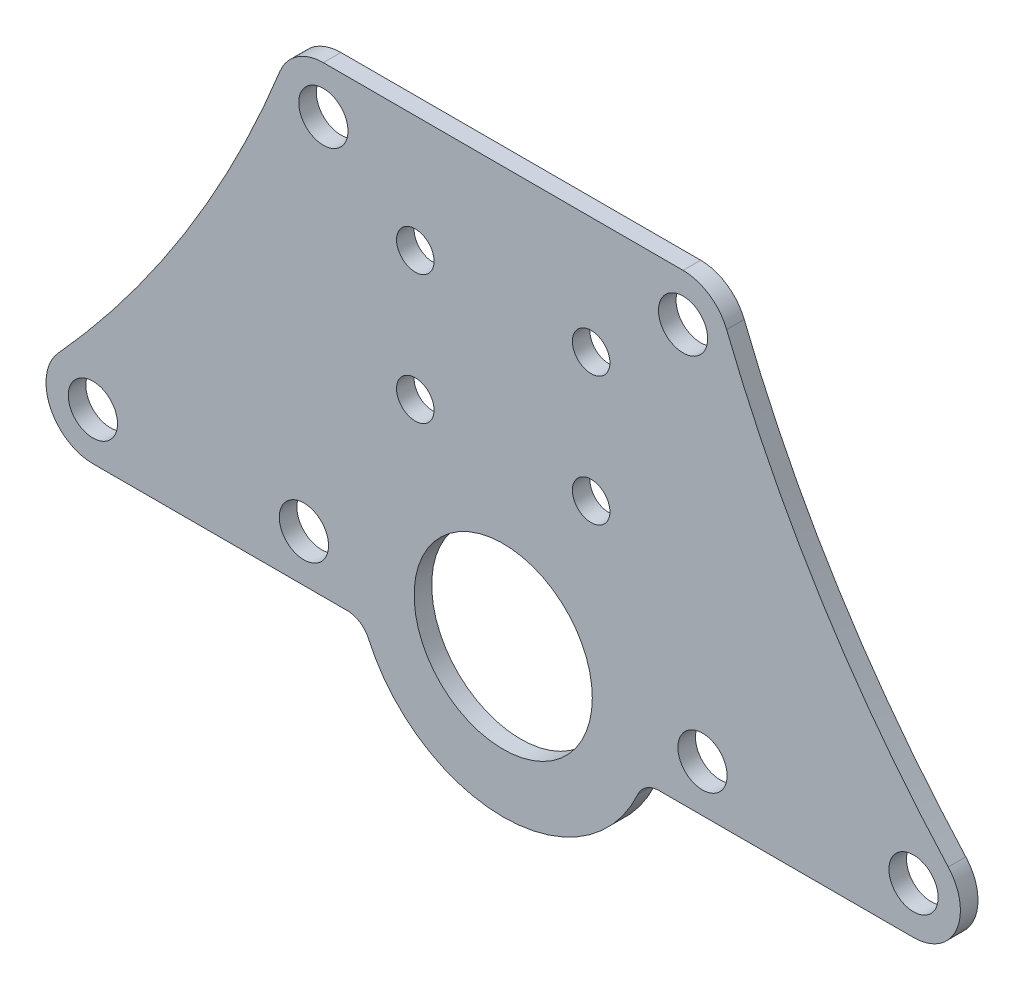
ISO-10303-21;
HEADER;
FILE_DESCRIPTION(('STEP AP214'),'2;1');
FILE_NAME('part.step','',(''),(''),'','','');
FILE_SCHEMA(('AUTOMOTIVE_DESIGN { 1 0 10303 214 1 1 1 1 }'));
ENDSEC;
DATA;
#1=APPLICATION_CONTEXT('core data for automotive mechanical design processes');
#2=APPLICATION_PROTOCOL_DEFINITION('international standard','automotive_design',2000,#1);
#3=PRODUCT_CONTEXT('',#1,'mechanical');
#4=PRODUCT('Part','Part','',(#3));
#5=PRODUCT_RELATED_PRODUCT_CATEGORY('part','',(#4));
#6=PRODUCT_DEFINITION_FORMATION('','',#4);
#7=PRODUCT_DEFINITION_CONTEXT('part definition',#1,'design');
#8=PRODUCT_DEFINITION('design','',#6,#7);
#9=PRODUCT_DEFINITION_SHAPE('','',#8);
#10=(LENGTH_UNIT() NAMED_UNIT(*) SI_UNIT(.MILLI.,.METRE.));
#11=(NAMED_UNIT(*) PLANE_ANGLE_UNIT() SI_UNIT($,.RADIAN.));
#12=(NAMED_UNIT(*) SI_UNIT($,.STERADIAN.) SOLID_ANGLE_UNIT());
#13=UNCERTAINTY_MEASURE_WITH_UNIT(LENGTH_MEASURE(1.E-05),#10,'distance_accuracy_value','');
#14=(GEOMETRIC_REPRESENTATION_CONTEXT(3) GLOBAL_UNCERTAINTY_ASSIGNED_CONTEXT((#13)) GLOBAL_UNIT_ASSIGNED_CONTEXT((#10,
#11,#12)) REPRESENTATION_CONTEXT('',''));
#15=CARTESIAN_POINT('',(0.,0.,0.));
#16=DIRECTION('',(0.,0.,1.));
#17=DIRECTION('',(1.,0.,0.));
#18=AXIS2_PLACEMENT_3D('',#15,#16,#17);
#19=CARTESIAN_POINT('',(0.,-20.,1.5));
#20=DIRECTION('',(0.,0.,-1.));
#21=DIRECTION('',(-1.,0.,0.));
#22=AXIS2_PLACEMENT_3D('',#19,#20,#21);
#23=CYLINDRICAL_SURFACE('',#22,12.6);
#24=CARTESIAN_POINT('',(0.,-20.,0.));
#25=DIRECTION('',(0.,0.,1.));
#26=DIRECTION('',(1.,0.,0.));
#27=AXIS2_PLACEMENT_3D('',#24,#25,#26);
#28=CIRCLE('',#27,12.6);
#29=CARTESIAN_POINT('',(-11.4868387650895,-25.1780821917808,0.));
#30=VERTEX_POINT('',#29);
#31=CARTESIAN_POINT('',(11.4868387650895,-25.1780821917808,0.));
#32=VERTEX_POINT('',#31);
#33=EDGE_CURVE('E230',#30,#32,#28,.T.);
#34=ORIENTED_EDGE('',*,*,#33,.T.);
#35=DIRECTION('',(0.,0.,-1.));
#36=VECTOR('',#35,1.);
#37=CARTESIAN_POINT('',(11.4868387650895,-25.1780821917808,1.5));
#38=LINE('',#37,#36);
#39=CARTESIAN_POINT('',(11.4868387650895,-25.1780821917808,1.5));
#40=VERTEX_POINT('',#39);
#41=EDGE_CURVE('E222',#32,#40,#38,.F.);
#42=ORIENTED_EDGE('',*,*,#41,.T.);
#43=CARTESIAN_POINT('',(0.,-20.,1.5));
#44=DIRECTION('',(0.,0.,1.));
#45=DIRECTION('',(1.,0.,0.));
#46=AXIS2_PLACEMENT_3D('',#43,#44,#45);
#47=CIRCLE('',#46,12.6);
#48=CARTESIAN_POINT('',(-11.4868387650895,-25.1780821917808,1.5));
#49=VERTEX_POINT('',#48);
#50=EDGE_CURVE('E139',#49,#40,#47,.T.);
#51=ORIENTED_EDGE('',*,*,#50,.F.);
#52=DIRECTION('',(0.,0.,-1.));
#53=VECTOR('',#52,1.);
#54=CARTESIAN_POINT('',(-11.4868387650895,-25.1780821917808,1.5));
#55=LINE('',#54,#53);
#56=EDGE_CURVE('E219',#49,#30,#55,.T.);
#57=ORIENTED_EDGE('',*,*,#56,.T.);
#58=EDGE_LOOP('',(#34,#42,#51,#57));
#59=FACE_BOUND('',#58,.T.);
#60=ADVANCED_FACE('F37',(#59),#23,.T.);
#61=CARTESIAN_POINT('',(0.,-24.,1.5));
#62=DIRECTION('',(0.,1.,0.));
#63=DIRECTION('',(-1.,0.,0.));
#64=AXIS2_PLACEMENT_3D('',#61,#62,#63);
#65=PLANE('',#64);
#66=DIRECTION('',(1.,0.,0.));
#67=VECTOR('',#66,1.);
#68=CARTESIAN_POINT('',(0.,-24.,1.5));
#69=LINE('',#68,#67);
#70=CARTESIAN_POINT('',(13.3101465055799,-24.,1.5));
#71=VERTEX_POINT('',#70);
#72=CARTESIAN_POINT('',(35.,-24.,1.5));
#73=VERTEX_POINT('',#72);
#74=EDGE_CURVE('E125',#71,#73,#69,.T.);
#75=ORIENTED_EDGE('',*,*,#74,.F.);
#76=DIRECTION('',(0.,0.,1.));
#77=VECTOR('',#76,1.);
#78=CARTESIAN_POINT('',(13.3101465055799,-24.,0.));
#79=LINE('',#78,#77);
#80=CARTESIAN_POINT('',(13.3101465055799,-24.,0.));
#81=VERTEX_POINT('',#80);
#82=EDGE_CURVE('E149',#71,#81,#79,.F.);
#83=ORIENTED_EDGE('',*,*,#82,.T.);
#84=DIRECTION('',(1.,0.,0.));
#85=VECTOR('',#84,1.);
#86=CARTESIAN_POINT('',(0.,-24.,0.));
#87=LINE('',#86,#85);
#88=CARTESIAN_POINT('',(35.,-24.,0.));
#89=VERTEX_POINT('',#88);
#90=EDGE_CURVE('E145',#81,#89,#87,.T.);
#91=ORIENTED_EDGE('',*,*,#90,.T.);
#92=DIRECTION('',(0.,0.,-1.));
#93=VECTOR('',#92,1.);
#94=CARTESIAN_POINT('',(35.,-24.,1.5));
#95=LINE('',#94,#93);
#96=EDGE_CURVE('E142',#73,#89,#95,.T.);
#97=ORIENTED_EDGE('',*,*,#96,.F.);
#98=EDGE_LOOP('',(#75,#83,#91,#97));
#99=FACE_BOUND('',#98,.T.);
#100=ADVANCED_FACE('F143',(#99),#65,.F.);
#101=CARTESIAN_POINT('',(35.,-20.,1.5));
#102=DIRECTION('',(0.,0.,-1.));
#103=DIRECTION('',(-1.,0.,0.));
#104=AXIS2_PLACEMENT_3D('',#101,#102,#103);
#105=CYLINDRICAL_SURFACE('',#104,4.00000000000002);
#106=CARTESIAN_POINT('',(35.,-20.,0.));
#107=DIRECTION('',(0.,0.,1.));
#108=DIRECTION('',(1.,0.,0.));
#109=AXIS2_PLACEMENT_3D('',#106,#107,#108);
#110=CIRCLE('',#109,4.00000000000002);
#111=CARTESIAN_POINT('',(37.9597935701072,-17.3093454286453,0.));
#112=VERTEX_POINT('',#111);
#113=EDGE_CURVE('E493',#89,#112,#110,.T.);
#114=ORIENTED_EDGE('',*,*,#113,.T.);
#115=DIRECTION('',(0.,0.,-1.));
#116=VECTOR('',#115,1.);
#117=CARTESIAN_POINT('',(37.9597935701072,-17.3093454286453,1.5));
#118=LINE('',#117,#116);
#119=CARTESIAN_POINT('',(37.9597935701072,-17.3093454286453,1.5));
#120=VERTEX_POINT('',#119);
#121=EDGE_CURVE('E150',#120,#112,#118,.T.);
#122=ORIENTED_EDGE('',*,*,#121,.F.);
#123=CARTESIAN_POINT('',(35.,-20.,1.5));
#124=DIRECTION('',(0.,0.,1.));
#125=DIRECTION('',(1.,0.,0.));
#126=AXIS2_PLACEMENT_3D('',#123,#124,#125);
#127=CIRCLE('',#126,4.00000000000002);
#128=EDGE_CURVE('E131',#73,#120,#127,.T.);
#129=ORIENTED_EDGE('',*,*,#128,.F.);
#130=ORIENTED_EDGE('',*,*,#96,.T.);
#131=EDGE_LOOP('',(#114,#122,#129,#130));
#132=FACE_BOUND('',#131,.T.);
#133=ADVANCED_FACE('F152',(#132),#105,.T.);
#134=CARTESIAN_POINT('',(111.954632822788,49.9570188552223,1.5));
#135=DIRECTION('',(0.,0.,-1.));
#136=DIRECTION('',(-1.,0.,0.));
#137=AXIS2_PLACEMENT_3D('',#134,#135,#136);
#138=CYLINDRICAL_SURFACE('',#137,100.);
#139=CARTESIAN_POINT('',(111.954632822788,49.9570188552223,0.));
#140=DIRECTION('',(0.,0.,1.));
#141=DIRECTION('',(1.,0.,0.));
#142=AXIS2_PLACEMENT_3D('',#139,#140,#141);
#143=CIRCLE('',#142,100.);
#144=CARTESIAN_POINT('',(19.0588225485857,12.9385311294998,0.));
#145=VERTEX_POINT('',#144);
#146=EDGE_CURVE('E495',#145,#112,#143,.T.);
#147=ORIENTED_EDGE('',*,*,#146,.F.);
#148=DIRECTION('',(0.,0.,-1.));
#149=VECTOR('',#148,1.);
#150=CARTESIAN_POINT('',(19.0588225485857,12.9385311294998,1.5));
#151=LINE('',#150,#149);
#152=CARTESIAN_POINT('',(19.0588225485857,12.9385311294998,1.5));
#153=VERTEX_POINT('',#152);
#154=EDGE_CURVE('E215',#153,#145,#151,.T.);
#155=ORIENTED_EDGE('',*,*,#154,.F.);
#156=CARTESIAN_POINT('',(111.954632822788,49.9570188552223,1.5));
#157=DIRECTION('',(0.,0.,1.));
#158=DIRECTION('',(1.,0.,0.));
#159=AXIS2_PLACEMENT_3D('',#156,#157,#158);
#160=CIRCLE('',#159,100.);
#161=EDGE_CURVE('E154',#153,#120,#160,.T.);
#162=ORIENTED_EDGE('',*,*,#161,.T.);
#163=ORIENTED_EDGE('',*,*,#121,.T.);
#164=EDGE_LOOP('',(#147,#155,#162,#163));
#165=FACE_BOUND('',#164,.T.);
#166=ADVANCED_FACE('F253',(#165),#138,.F.);
#167=CARTESIAN_POINT('',(15.3429901376176,11.4577916204709,1.5));
#168=DIRECTION('',(0.,0.,-1.));
#169=DIRECTION('',(-1.,0.,0.));
#170=AXIS2_PLACEMENT_3D('',#167,#168,#169);
#171=CYLINDRICAL_SURFACE('',#170,4.00000000000002);
#172=CARTESIAN_POINT('',(15.3429901376176,11.4577916204709,0.));
#173=DIRECTION('',(0.,0.,1.));
#174=DIRECTION('',(1.,0.,0.));
#175=AXIS2_PLACEMENT_3D('',#172,#173,#174);
#176=CIRCLE('',#175,4.00000000000002);
#177=CARTESIAN_POINT('',(15.3429901376176,15.4577916204709,0.));
#178=VERTEX_POINT('',#177);
#179=EDGE_CURVE('E498',#145,#178,#176,.T.);
#180=ORIENTED_EDGE('',*,*,#179,.T.);
#181=DIRECTION('',(0.,0.,-1.));
#182=VECTOR('',#181,1.);
#183=CARTESIAN_POINT('',(15.3429901376176,15.4577916204709,1.5));
#184=LINE('',#183,#182);
#185=CARTESIAN_POINT('',(15.3429901376176,15.4577916204709,1.5));
#186=VERTEX_POINT('',#185);
#187=EDGE_CURVE('E213',#186,#178,#184,.T.);
#188=ORIENTED_EDGE('',*,*,#187,.F.);
#189=CARTESIAN_POINT('',(15.3429901376176,11.4577916204709,1.5));
#190=DIRECTION('',(0.,0.,1.));
#191=DIRECTION('',(1.,0.,0.));
#192=AXIS2_PLACEMENT_3D('',#189,#190,#191);
#193=CIRCLE('',#192,4.00000000000002);
#194=EDGE_CURVE('E156',#153,#186,#193,.T.);
#195=ORIENTED_EDGE('',*,*,#194,.F.);
#196=ORIENTED_EDGE('',*,*,#154,.T.);
#197=EDGE_LOOP('',(#180,#188,#195,#196));
#198=FACE_BOUND('',#197,.T.);
#199=ADVANCED_FACE('F256',(#198),#171,.T.);
#200=CARTESIAN_POINT('',(0.,15.4577916204709,1.5));
#201=DIRECTION('',(0.,1.,0.));
#202=DIRECTION('',(0.,0.,1.));
#203=AXIS2_PLACEMENT_3D('',#200,#201,#202);
#204=PLANE('',#203);
#205=DIRECTION('',(1.,0.,0.));
#206=VECTOR('',#205,1.);
#207=CARTESIAN_POINT('',(0.,15.4577916204709,0.));
#208=LINE('',#207,#206);
#209=CARTESIAN_POINT('',(-15.3429901376176,15.4577916204709,0.));
#210=VERTEX_POINT('',#209);
#211=EDGE_CURVE('E501',#210,#178,#208,.T.);
#212=ORIENTED_EDGE('',*,*,#211,.F.);
#213=DIRECTION('',(0.,0.,-1.));
#214=VECTOR('',#213,1.);
#215=CARTESIAN_POINT('',(-15.3429901376176,15.4577916204709,1.5));
#216=LINE('',#215,#214);
#217=CARTESIAN_POINT('',(-15.3429901376176,15.4577916204709,1.5));
#218=VERTEX_POINT('',#217);
#219=EDGE_CURVE('E211',#218,#210,#216,.T.);
#220=ORIENTED_EDGE('',*,*,#219,.F.);
#221=DIRECTION('',(1.,0.,0.));
#222=VECTOR('',#221,1.);
#223=CARTESIAN_POINT('',(0.,15.4577916204709,1.5));
#224=LINE('',#223,#222);
#225=EDGE_CURVE('E172',#218,#186,#224,.T.);
#226=ORIENTED_EDGE('',*,*,#225,.T.);
#227=ORIENTED_EDGE('',*,*,#187,.T.);
#228=EDGE_LOOP('',(#212,#220,#226,#227));
#229=FACE_BOUND('',#228,.T.);
#230=ADVANCED_FACE('F260',(#229),#204,.T.);
#231=CARTESIAN_POINT('',(-15.3429901376176,11.4577916204709,1.5));
#232=DIRECTION('',(0.,0.,-1.));
#233=DIRECTION('',(-1.,0.,0.));
#234=AXIS2_PLACEMENT_3D('',#231,#232,#233);
#235=CYLINDRICAL_SURFACE('',#234,4.00000000000002);
#236=CARTESIAN_POINT('',(-15.3429901376176,11.4577916204709,0.));
#237=DIRECTION('',(0.,0.,1.));
#238=DIRECTION('',(1.,0.,0.));
#239=AXIS2_PLACEMENT_3D('',#236,#237,#238);
#240=CIRCLE('',#239,4.00000000000002);
#241=CARTESIAN_POINT('',(-19.0588225485857,12.9385311294998,0.));
#242=VERTEX_POINT('',#241);
#243=EDGE_CURVE('E504',#242,#210,#240,.F.);
#244=ORIENTED_EDGE('',*,*,#243,.F.);
#245=DIRECTION('',(0.,0.,-1.));
#246=VECTOR('',#245,1.);
#247=CARTESIAN_POINT('',(-19.0588225485857,12.9385311294998,1.5));
#248=LINE('',#247,#246);
#249=CARTESIAN_POINT('',(-19.0588225485857,12.9385311294998,1.5));
#250=VERTEX_POINT('',#249);
#251=EDGE_CURVE('E209',#250,#242,#248,.T.);
#252=ORIENTED_EDGE('',*,*,#251,.F.);
#253=CARTESIAN_POINT('',(-15.3429901376176,11.4577916204709,1.5));
#254=DIRECTION('',(0.,0.,1.));
#255=DIRECTION('',(1.,0.,0.));
#256=AXIS2_PLACEMENT_3D('',#253,#254,#255);
#257=CIRCLE('',#256,4.00000000000002);
#258=EDGE_CURVE('E176',#250,#218,#257,.F.);
#259=ORIENTED_EDGE('',*,*,#258,.T.);
#260=ORIENTED_EDGE('',*,*,#219,.T.);
#261=EDGE_LOOP('',(#244,#252,#259,#260));
#262=FACE_BOUND('',#261,.T.);
#263=ADVANCED_FACE('F264',(#262),#235,.T.);
#264=CARTESIAN_POINT('',(-111.954632822788,49.9570188552223,1.5));
#265=DIRECTION('',(0.,0.,-1.));
#266=DIRECTION('',(-1.,0.,0.));
#267=AXIS2_PLACEMENT_3D('',#264,#265,#266);
#268=CYLINDRICAL_SURFACE('',#267,100.);
#269=CARTESIAN_POINT('',(-111.954632822788,49.9570188552223,0.));
#270=DIRECTION('',(0.,0.,1.));
#271=DIRECTION('',(1.,0.,0.));
#272=AXIS2_PLACEMENT_3D('',#269,#270,#271);
#273=CIRCLE('',#272,100.);
#274=CARTESIAN_POINT('',(-37.9597935701072,-17.3093454286453,0.));
#275=VERTEX_POINT('',#274);
#276=EDGE_CURVE('E507',#242,#275,#273,.F.);
#277=ORIENTED_EDGE('',*,*,#276,.T.);
#278=DIRECTION('',(0.,0.,-1.));
#279=VECTOR('',#278,1.);
#280=CARTESIAN_POINT('',(-37.9597935701072,-17.3093454286453,1.5));
#281=LINE('',#280,#279);
#282=CARTESIAN_POINT('',(-37.9597935701072,-17.3093454286453,1.5));
#283=VERTEX_POINT('',#282);
#284=EDGE_CURVE('E206',#283,#275,#281,.T.);
#285=ORIENTED_EDGE('',*,*,#284,.F.);
#286=CARTESIAN_POINT('',(-111.954632822788,49.9570188552223,1.5));
#287=DIRECTION('',(0.,0.,1.));
#288=DIRECTION('',(1.,0.,0.));
#289=AXIS2_PLACEMENT_3D('',#286,#287,#288);
#290=CIRCLE('',#289,100.);
#291=EDGE_CURVE('E179',#250,#283,#290,.F.);
#292=ORIENTED_EDGE('',*,*,#291,.F.);
#293=ORIENTED_EDGE('',*,*,#251,.T.);
#294=EDGE_LOOP('',(#277,#285,#292,#293));
#295=FACE_BOUND('',#294,.T.);
#296=ADVANCED_FACE('F268',(#295),#268,.F.);
#297=CARTESIAN_POINT('',(-35.,-20.,1.5));
#298=DIRECTION('',(0.,0.,-1.));
#299=DIRECTION('',(-1.,0.,0.));
#300=AXIS2_PLACEMENT_3D('',#297,#298,#299);
#301=CYLINDRICAL_SURFACE('',#300,4.00000000000002);
#302=CARTESIAN_POINT('',(-35.,-20.,0.));
#303=DIRECTION('',(0.,0.,1.));
#304=DIRECTION('',(1.,0.,0.));
#305=AXIS2_PLACEMENT_3D('',#302,#303,#304);
#306=CIRCLE('',#305,4.00000000000002);
#307=CARTESIAN_POINT('',(-35.,-24.,0.));
#308=VERTEX_POINT('',#307);
#309=EDGE_CURVE('E510',#308,#275,#306,.F.);
#310=ORIENTED_EDGE('',*,*,#309,.F.);
#311=DIRECTION('',(0.,0.,-1.));
#312=VECTOR('',#311,1.);
#313=CARTESIAN_POINT('',(-35.,-24.,1.5));
#314=LINE('',#313,#312);
#315=CARTESIAN_POINT('',(-35.,-24.,1.5));
#316=VERTEX_POINT('',#315);
#317=EDGE_CURVE('E204',#316,#308,#314,.T.);
#318=ORIENTED_EDGE('',*,*,#317,.F.);
#319=CARTESIAN_POINT('',(-35.,-20.,1.5));
#320=DIRECTION('',(0.,0.,1.));
#321=DIRECTION('',(1.,0.,0.));
#322=AXIS2_PLACEMENT_3D('',#319,#320,#321);
#323=CIRCLE('',#322,4.00000000000002);
#324=EDGE_CURVE('E181',#316,#283,#323,.F.);
#325=ORIENTED_EDGE('',*,*,#324,.T.);
#326=ORIENTED_EDGE('',*,*,#284,.T.);
#327=EDGE_LOOP('',(#310,#318,#325,#326));
#328=FACE_BOUND('',#327,.T.);
#329=ADVANCED_FACE('F272',(#328),#301,.T.);
#330=CARTESIAN_POINT('',(-15.3429901376176,11.4577916204709,1.5));
#331=DIRECTION('',(0.,0.,-1.));
#332=DIRECTION('',(-1.,0.,0.));
#333=AXIS2_PLACEMENT_3D('',#330,#331,#332);
#334=CYLINDRICAL_SURFACE('',#333,2.1);
#335=CARTESIAN_POINT('',(-15.3429901376176,11.4577916204709,1.5));
#336=DIRECTION('',(0.,0.,1.));
#337=DIRECTION('',(1.,0.,0.));
#338=AXIS2_PLACEMENT_3D('',#335,#336,#337);
#339=CIRCLE('',#338,2.1);
#340=CARTESIAN_POINT('',(-13.2429901376176,11.4577916204709,1.5));
#341=VERTEX_POINT('',#340);
#342=EDGE_CURVE('E486',#341,#341,#339,.F.);
#343=ORIENTED_EDGE('',*,*,#342,.F.);
#344=EDGE_LOOP('',(#343));
#345=FACE_BOUND('',#344,.T.);
#346=CARTESIAN_POINT('',(-15.3429901376176,11.4577916204709,0.));
#347=DIRECTION('',(0.,0.,1.));
#348=DIRECTION('',(1.,0.,0.));
#349=AXIS2_PLACEMENT_3D('',#346,#347,#348);
#350=CIRCLE('',#349,2.1);
#351=CARTESIAN_POINT('',(-13.2429901376176,11.4577916204709,0.));
#352=VERTEX_POINT('',#351);
#353=EDGE_CURVE('E195',#352,#352,#350,.F.);
#354=ORIENTED_EDGE('',*,*,#353,.T.);
#355=EDGE_LOOP('',(#354));
#356=FACE_BOUND('',#355,.T.);
#357=ADVANCED_FACE('F276',(#345,#356),#334,.F.);
#358=CARTESIAN_POINT('',(15.3429901376176,11.4577916204709,1.5));
#359=DIRECTION('',(0.,0.,-1.));
#360=DIRECTION('',(-1.,0.,0.));
#361=AXIS2_PLACEMENT_3D('',#358,#359,#360);
#362=CYLINDRICAL_SURFACE('',#361,2.09999999999998);
#363=CARTESIAN_POINT('',(15.3429901376176,11.4577916204709,1.5));
#364=DIRECTION('',(0.,0.,1.));
#365=DIRECTION('',(1.,0.,0.));
#366=AXIS2_PLACEMENT_3D('',#363,#364,#365);
#367=CIRCLE('',#366,2.09999999999998);
#368=CARTESIAN_POINT('',(17.4429901376176,11.4577916204709,1.5));
#369=VERTEX_POINT('',#368);
#370=EDGE_CURVE('E489',#369,#369,#367,.T.);
#371=ORIENTED_EDGE('',*,*,#370,.T.);
#372=EDGE_LOOP('',(#371));
#373=FACE_BOUND('',#372,.T.);
#374=CARTESIAN_POINT('',(15.3429901376176,11.4577916204709,0.));
#375=DIRECTION('',(0.,0.,1.));
#376=DIRECTION('',(1.,0.,0.));
#377=AXIS2_PLACEMENT_3D('',#374,#375,#376);
#378=CIRCLE('',#377,2.09999999999998);
#379=CARTESIAN_POINT('',(17.4429901376176,11.4577916204709,0.));
#380=VERTEX_POINT('',#379);
#381=EDGE_CURVE('E200',#380,#380,#378,.T.);
#382=ORIENTED_EDGE('',*,*,#381,.F.);
#383=EDGE_LOOP('',(#382));
#384=FACE_BOUND('',#383,.T.);
#385=ADVANCED_FACE('F313',(#373,#384),#362,.F.);
#386=CARTESIAN_POINT('',(7.5,-5.5,1.5));
#387=DIRECTION('',(0.,0.,-1.));
#388=DIRECTION('',(-1.,0.,0.));
#389=AXIS2_PLACEMENT_3D('',#386,#387,#388);
#390=CYLINDRICAL_SURFACE('',#389,1.6);
#391=CARTESIAN_POINT('',(7.5,-5.5,1.5));
#392=DIRECTION('',(0.,0.,1.));
#393=DIRECTION('',(1.,0.,0.));
#394=AXIS2_PLACEMENT_3D('',#391,#392,#393);
#395=CIRCLE('',#394,1.6);
#396=CARTESIAN_POINT('',(9.1,-5.5,1.5));
#397=VERTEX_POINT('',#396);
#398=EDGE_CURVE('E586',#397,#397,#395,.F.);
#399=ORIENTED_EDGE('',*,*,#398,.F.);
#400=EDGE_LOOP('',(#399));
#401=FACE_BOUND('',#400,.T.);
#402=CARTESIAN_POINT('',(7.5,-5.5,0.));
#403=DIRECTION('',(0.,0.,1.));
#404=DIRECTION('',(1.,0.,0.));
#405=AXIS2_PLACEMENT_3D('',#402,#403,#404);
#406=CIRCLE('',#405,1.6);
#407=CARTESIAN_POINT('',(9.1,-5.5,0.));
#408=VERTEX_POINT('',#407);
#409=EDGE_CURVE('E536',#408,#408,#406,.F.);
#410=ORIENTED_EDGE('',*,*,#409,.T.);
#411=EDGE_LOOP('',(#410));
#412=FACE_BOUND('',#411,.T.);
#413=ADVANCED_FACE('F309',(#401,#412),#390,.F.);
#414=CARTESIAN_POINT('',(7.5,5.5,1.5));
#415=DIRECTION('',(0.,0.,-1.));
#416=DIRECTION('',(-1.,0.,0.));
#417=AXIS2_PLACEMENT_3D('',#414,#415,#416);
#418=CYLINDRICAL_SURFACE('',#417,1.6);
#419=CARTESIAN_POINT('',(7.5,5.5,1.5));
#420=DIRECTION('',(0.,0.,1.));
#421=DIRECTION('',(1.,0.,0.));
#422=AXIS2_PLACEMENT_3D('',#419,#420,#421);
#423=CIRCLE('',#422,1.6);
#424=CARTESIAN_POINT('',(9.1,5.5,1.5));
#425=VERTEX_POINT('',#424);
#426=EDGE_CURVE('E589',#425,#425,#423,.T.);
#427=ORIENTED_EDGE('',*,*,#426,.T.);
#428=EDGE_LOOP('',(#427));
#429=FACE_BOUND('',#428,.T.);
#430=CARTESIAN_POINT('',(7.5,5.5,0.));
#431=DIRECTION('',(0.,0.,1.));
#432=DIRECTION('',(1.,0.,0.));
#433=AXIS2_PLACEMENT_3D('',#430,#431,#432);
#434=CIRCLE('',#433,1.6);
#435=CARTESIAN_POINT('',(9.1,5.5,0.));
#436=VERTEX_POINT('',#435);
#437=EDGE_CURVE('E533',#436,#436,#434,.T.);
#438=ORIENTED_EDGE('',*,*,#437,.F.);
#439=EDGE_LOOP('',(#438));
#440=FACE_BOUND('',#439,.T.);
#441=ADVANCED_FACE('F305',(#429,#440),#418,.F.);
#442=CARTESIAN_POINT('',(-7.5,5.5,1.5));
#443=DIRECTION('',(0.,0.,-1.));
#444=DIRECTION('',(-1.,0.,0.));
#445=AXIS2_PLACEMENT_3D('',#442,#443,#444);
#446=CYLINDRICAL_SURFACE('',#445,1.6);
#447=CARTESIAN_POINT('',(-7.5,5.5,1.5));
#448=DIRECTION('',(0.,0.,1.));
#449=DIRECTION('',(1.,0.,0.));
#450=AXIS2_PLACEMENT_3D('',#447,#448,#449);
#451=CIRCLE('',#450,1.6);
#452=CARTESIAN_POINT('',(-5.9,5.5,1.5));
#453=VERTEX_POINT('',#452);
#454=EDGE_CURVE('E593',#453,#453,#451,.F.);
#455=ORIENTED_EDGE('',*,*,#454,.F.);
#456=EDGE_LOOP('',(#455));
#457=FACE_BOUND('',#456,.T.);
#458=CARTESIAN_POINT('',(-7.5,5.5,0.));
#459=DIRECTION('',(0.,0.,1.));
#460=DIRECTION('',(1.,0.,0.));
#461=AXIS2_PLACEMENT_3D('',#458,#459,#460);
#462=CIRCLE('',#461,1.6);
#463=CARTESIAN_POINT('',(-5.9,5.5,0.));
#464=VERTEX_POINT('',#463);
#465=EDGE_CURVE('E530',#464,#464,#462,.F.);
#466=ORIENTED_EDGE('',*,*,#465,.T.);
#467=EDGE_LOOP('',(#466));
#468=FACE_BOUND('',#467,.T.);
#469=ADVANCED_FACE('F301',(#457,#468),#446,.F.);
#470=CARTESIAN_POINT('',(-7.5,-5.5,1.5));
#471=DIRECTION('',(0.,0.,-1.));
#472=DIRECTION('',(-1.,0.,0.));
#473=AXIS2_PLACEMENT_3D('',#470,#471,#472);
#474=CYLINDRICAL_SURFACE('',#473,1.6);
#475=CARTESIAN_POINT('',(-7.5,-5.5,1.5));
#476=DIRECTION('',(0.,0.,1.));
#477=DIRECTION('',(1.,0.,0.));
#478=AXIS2_PLACEMENT_3D('',#475,#476,#477);
#479=CIRCLE('',#478,1.6);
#480=CARTESIAN_POINT('',(-5.9,-5.5,1.5));
#481=VERTEX_POINT('',#480);
#482=EDGE_CURVE('E599',#481,#481,#479,.T.);
#483=ORIENTED_EDGE('',*,*,#482,.T.);
#484=EDGE_LOOP('',(#483));
#485=FACE_BOUND('',#484,.T.);
#486=CARTESIAN_POINT('',(-7.5,-5.5,0.));
#487=DIRECTION('',(0.,0.,1.));
#488=DIRECTION('',(1.,0.,0.));
#489=AXIS2_PLACEMENT_3D('',#486,#487,#488);
#490=CIRCLE('',#489,1.6);
#491=CARTESIAN_POINT('',(-5.9,-5.5,0.));
#492=VERTEX_POINT('',#491);
#493=EDGE_CURVE('E527',#492,#492,#490,.T.);
#494=ORIENTED_EDGE('',*,*,#493,.F.);
#495=EDGE_LOOP('',(#494));
#496=FACE_BOUND('',#495,.T.);
#497=ADVANCED_FACE('F297',(#485,#496),#474,.F.);
#498=CARTESIAN_POINT('',(35.,-20.,1.5));
#499=DIRECTION('',(0.,0.,-1.));
#500=DIRECTION('',(-1.,0.,0.));
#501=AXIS2_PLACEMENT_3D('',#498,#499,#500);
#502=CYLINDRICAL_SURFACE('',#501,2.1);
#503=CARTESIAN_POINT('',(35.,-20.,1.5));
#504=DIRECTION('',(0.,0.,1.));
#505=DIRECTION('',(1.,0.,0.));
#506=AXIS2_PLACEMENT_3D('',#503,#504,#505);
#507=CIRCLE('',#506,2.1);
#508=CARTESIAN_POINT('',(37.1,-20.,1.5));
#509=VERTEX_POINT('',#508);
#510=EDGE_CURVE('E602',#509,#509,#507,.T.);
#511=ORIENTED_EDGE('',*,*,#510,.T.);
#512=EDGE_LOOP('',(#511));
#513=FACE_BOUND('',#512,.T.);
#514=CARTESIAN_POINT('',(35.,-20.,0.));
#515=DIRECTION('',(0.,0.,1.));
#516=DIRECTION('',(1.,0.,0.));
#517=AXIS2_PLACEMENT_3D('',#514,#515,#516);
#518=CIRCLE('',#517,2.1);
#519=CARTESIAN_POINT('',(37.1,-20.,0.));
#520=VERTEX_POINT('',#519);
#521=EDGE_CURVE('E524',#520,#520,#518,.T.);
#522=ORIENTED_EDGE('',*,*,#521,.F.);
#523=EDGE_LOOP('',(#522));
#524=FACE_BOUND('',#523,.T.);
#525=ADVANCED_FACE('F293',(#513,#524),#502,.F.);
#526=CARTESIAN_POINT('',(-35.,-20.,1.5));
#527=DIRECTION('',(0.,0.,-1.));
#528=DIRECTION('',(-1.,0.,0.));
#529=AXIS2_PLACEMENT_3D('',#526,#527,#528);
#530=CYLINDRICAL_SURFACE('',#529,2.1);
#531=CARTESIAN_POINT('',(-35.,-20.,1.5));
#532=DIRECTION('',(0.,0.,1.));
#533=DIRECTION('',(1.,0.,0.));
#534=AXIS2_PLACEMENT_3D('',#531,#532,#533);
#535=CIRCLE('',#534,2.1);
#536=CARTESIAN_POINT('',(-32.9,-20.,1.5));
#537=VERTEX_POINT('',#536);
#538=EDGE_CURVE('E606',#537,#537,#535,.F.);
#539=ORIENTED_EDGE('',*,*,#538,.F.);
#540=EDGE_LOOP('',(#539));
#541=FACE_BOUND('',#540,.T.);
#542=CARTESIAN_POINT('',(-35.,-20.,0.));
#543=DIRECTION('',(0.,0.,1.));
#544=DIRECTION('',(1.,0.,0.));
#545=AXIS2_PLACEMENT_3D('',#542,#543,#544);
#546=CIRCLE('',#545,2.1);
#547=CARTESIAN_POINT('',(-32.9,-20.,0.));
#548=VERTEX_POINT('',#547);
#549=EDGE_CURVE('E521',#548,#548,#546,.F.);
#550=ORIENTED_EDGE('',*,*,#549,.T.);
#551=EDGE_LOOP('',(#550));
#552=FACE_BOUND('',#551,.T.);
#553=ADVANCED_FACE('F289',(#541,#552),#530,.F.);
#554=CARTESIAN_POINT('',(17.,-20.,1.5));
#555=DIRECTION('',(0.,0.,-1.));
#556=DIRECTION('',(-1.,0.,0.));
#557=AXIS2_PLACEMENT_3D('',#554,#555,#556);
#558=CYLINDRICAL_SURFACE('',#557,2.1);
#559=CARTESIAN_POINT('',(17.,-20.,1.5));
#560=DIRECTION('',(0.,0.,1.));
#561=DIRECTION('',(1.,0.,0.));
#562=AXIS2_PLACEMENT_3D('',#559,#560,#561);
#563=CIRCLE('',#562,2.1);
#564=CARTESIAN_POINT('',(19.1,-20.,1.5));
#565=VERTEX_POINT('',#564);
#566=EDGE_CURVE('E608',#565,#565,#563,.T.);
#567=ORIENTED_EDGE('',*,*,#566,.T.);
#568=EDGE_LOOP('',(#567));
#569=FACE_BOUND('',#568,.T.);
#570=CARTESIAN_POINT('',(17.,-20.,0.));
#571=DIRECTION('',(0.,0.,1.));
#572=DIRECTION('',(1.,0.,0.));
#573=AXIS2_PLACEMENT_3D('',#570,#571,#572);
#574=CIRCLE('',#573,2.1);
#575=CARTESIAN_POINT('',(19.1,-20.,0.));
#576=VERTEX_POINT('',#575);
#577=EDGE_CURVE('E518',#576,#576,#574,.T.);
#578=ORIENTED_EDGE('',*,*,#577,.F.);
#579=EDGE_LOOP('',(#578));
#580=FACE_BOUND('',#579,.T.);
#581=ADVANCED_FACE('F285',(#569,#580),#558,.F.);
#582=CARTESIAN_POINT('',(0.,-20.,1.5));
#583=DIRECTION('',(0.,0.,-1.));
#584=DIRECTION('',(-1.,0.,0.));
#585=AXIS2_PLACEMENT_3D('',#582,#583,#584);
#586=CYLINDRICAL_SURFACE('',#585,7.6);
#587=CARTESIAN_POINT('',(0.,-20.,1.5));
#588=DIRECTION('',(0.,0.,1.));
#589=DIRECTION('',(1.,0.,0.));
#590=AXIS2_PLACEMENT_3D('',#587,#588,#589);
#591=CIRCLE('',#590,7.6);
#592=CARTESIAN_POINT('',(7.6,-20.,1.5));
#593=VERTEX_POINT('',#592);
#594=EDGE_CURVE('E187',#593,#593,#591,.T.);
#595=ORIENTED_EDGE('',*,*,#594,.T.);
#596=EDGE_LOOP('',(#595));
#597=FACE_BOUND('',#596,.T.);
#598=CARTESIAN_POINT('',(0.,-20.,0.));
#599=DIRECTION('',(0.,0.,1.));
#600=DIRECTION('',(1.,0.,0.));
#601=AXIS2_PLACEMENT_3D('',#598,#599,#600);
#602=CIRCLE('',#601,7.6);
#603=CARTESIAN_POINT('',(7.6,-20.,0.));
#604=VERTEX_POINT('',#603);
#605=EDGE_CURVE('E515',#604,#604,#602,.T.);
#606=ORIENTED_EDGE('',*,*,#605,.F.);
#607=EDGE_LOOP('',(#606));
#608=FACE_BOUND('',#607,.T.);
#609=ADVANCED_FACE('F282',(#597,#608),#586,.F.);
#610=CARTESIAN_POINT('',(0.,-24.,1.5));
#611=DIRECTION('',(0.,1.,0.));
#612=DIRECTION('',(-1.,0.,0.));
#613=AXIS2_PLACEMENT_3D('',#610,#611,#612);
#614=PLANE('',#613);
#615=DIRECTION('',(1.,0.,0.));
#616=VECTOR('',#615,1.);
#617=CARTESIAN_POINT('',(0.,-24.,0.));
#618=LINE('',#617,#616);
#619=CARTESIAN_POINT('',(-13.3101465055799,-24.,0.));
#620=VERTEX_POINT('',#619);
#621=EDGE_CURVE('E513',#308,#620,#618,.T.);
#622=ORIENTED_EDGE('',*,*,#621,.T.);
#623=DIRECTION('',(0.,0.,1.));
#624=VECTOR('',#623,1.);
#625=CARTESIAN_POINT('',(-13.3101465055799,-24.,1.5));
#626=LINE('',#625,#624);
#627=CARTESIAN_POINT('',(-13.3101465055799,-24.,1.5));
#628=VERTEX_POINT('',#627);
#629=EDGE_CURVE('E52',#620,#628,#626,.T.);
#630=ORIENTED_EDGE('',*,*,#629,.T.);
#631=DIRECTION('',(1.,0.,0.));
#632=VECTOR('',#631,1.);
#633=CARTESIAN_POINT('',(0.,-24.,1.5));
#634=LINE('',#633,#632);
#635=EDGE_CURVE('E184',#316,#628,#634,.T.);
#636=ORIENTED_EDGE('',*,*,#635,.F.);
#637=ORIENTED_EDGE('',*,*,#317,.T.);
#638=EDGE_LOOP('',(#622,#630,#636,#637));
#639=FACE_BOUND('',#638,.T.);
#640=ADVANCED_FACE('F278',(#639),#614,.F.);
#641=CARTESIAN_POINT('',(-17.,-20.,1.5));
#642=DIRECTION('',(0.,0.,-1.));
#643=DIRECTION('',(-1.,0.,0.));
#644=AXIS2_PLACEMENT_3D('',#641,#642,#643);
#645=CYLINDRICAL_SURFACE('',#644,2.09999999999999);
#646=CARTESIAN_POINT('',(-17.,-20.,1.5));
#647=DIRECTION('',(0.,0.,1.));
#648=DIRECTION('',(1.,0.,0.));
#649=AXIS2_PLACEMENT_3D('',#646,#647,#648);
#650=CIRCLE('',#649,2.09999999999999);
#651=CARTESIAN_POINT('',(-14.9,-20.,1.5));
#652=VERTEX_POINT('',#651);
#653=EDGE_CURVE('E207',#652,#652,#650,.F.);
#654=ORIENTED_EDGE('',*,*,#653,.F.);
#655=EDGE_LOOP('',(#654));
#656=FACE_BOUND('',#655,.T.);
#657=CARTESIAN_POINT('',(-17.,-20.,0.));
#658=DIRECTION('',(0.,0.,1.));
#659=DIRECTION('',(1.,0.,0.));
#660=AXIS2_PLACEMENT_3D('',#657,#658,#659);
#661=CIRCLE('',#660,2.09999999999999);
#662=CARTESIAN_POINT('',(-14.9,-20.,0.));
#663=VERTEX_POINT('',#662);
#664=EDGE_CURVE('E192',#663,#663,#661,.F.);
#665=ORIENTED_EDGE('',*,*,#664,.T.);
#666=EDGE_LOOP('',(#665));
#667=FACE_BOUND('',#666,.T.);
#668=ADVANCED_FACE('F281',(#656,#667),#645,.F.);
#669=CARTESIAN_POINT('',(0.,0.,1.5));
#670=DIRECTION('',(0.,0.,1.));
#671=DIRECTION('',(1.,0.,0.));
#672=AXIS2_PLACEMENT_3D('',#669,#670,#671);
#673=PLANE('',#672);
#674=ORIENTED_EDGE('',*,*,#635,.T.);
#675=CARTESIAN_POINT('',(-13.3101465055799,-26.,1.5));
#676=DIRECTION('',(0.,0.,1.));
#677=DIRECTION('',(1.,0.,0.));
#678=AXIS2_PLACEMENT_3D('',#675,#676,#677);
#679=CIRCLE('',#678,2.);
#680=EDGE_CURVE('E12',#628,#49,#679,.F.);
#681=ORIENTED_EDGE('',*,*,#680,.T.);
#682=ORIENTED_EDGE('',*,*,#50,.T.);
#683=CARTESIAN_POINT('',(13.3101465055799,-26.,1.5));
#684=DIRECTION('',(0.,0.,1.));
#685=DIRECTION('',(1.,0.,0.));
#686=AXIS2_PLACEMENT_3D('',#683,#684,#685);
#687=CIRCLE('',#686,2.);
#688=EDGE_CURVE('E135',#40,#71,#687,.F.);
#689=ORIENTED_EDGE('',*,*,#688,.T.);
#690=ORIENTED_EDGE('',*,*,#74,.T.);
#691=ORIENTED_EDGE('',*,*,#128,.T.);
#692=ORIENTED_EDGE('',*,*,#161,.F.);
#693=ORIENTED_EDGE('',*,*,#194,.T.);
#694=ORIENTED_EDGE('',*,*,#225,.F.);
#695=ORIENTED_EDGE('',*,*,#258,.F.);
#696=ORIENTED_EDGE('',*,*,#291,.T.);
#697=ORIENTED_EDGE('',*,*,#324,.F.);
#698=EDGE_LOOP('',(#674,#681,#682,#689,#690,#691,#692,#693,#694,#695,#696,#697));
#699=FACE_BOUND('',#698,.T.);
#700=ORIENTED_EDGE('',*,*,#594,.F.);
#701=EDGE_LOOP('',(#700));
#702=FACE_BOUND('',#701,.T.);
#703=ORIENTED_EDGE('',*,*,#566,.F.);
#704=EDGE_LOOP('',(#703));
#705=FACE_BOUND('',#704,.T.);
#706=ORIENTED_EDGE('',*,*,#538,.T.);
#707=EDGE_LOOP('',(#706));
#708=FACE_BOUND('',#707,.T.);
#709=ORIENTED_EDGE('',*,*,#510,.F.);
#710=EDGE_LOOP('',(#709));
#711=FACE_BOUND('',#710,.T.);
#712=ORIENTED_EDGE('',*,*,#482,.F.);
#713=EDGE_LOOP('',(#712));
#714=FACE_BOUND('',#713,.T.);
#715=ORIENTED_EDGE('',*,*,#454,.T.);
#716=EDGE_LOOP('',(#715));
#717=FACE_BOUND('',#716,.T.);
#718=ORIENTED_EDGE('',*,*,#426,.F.);
#719=EDGE_LOOP('',(#718));
#720=FACE_BOUND('',#719,.T.);
#721=ORIENTED_EDGE('',*,*,#398,.T.);
#722=EDGE_LOOP('',(#721));
#723=FACE_BOUND('',#722,.T.);
#724=ORIENTED_EDGE('',*,*,#370,.F.);
#725=EDGE_LOOP('',(#724));
#726=FACE_BOUND('',#725,.T.);
#727=ORIENTED_EDGE('',*,*,#342,.T.);
#728=EDGE_LOOP('',(#727));
#729=FACE_BOUND('',#728,.T.);
#730=ORIENTED_EDGE('',*,*,#653,.T.);
#731=EDGE_LOOP('',(#730));
#732=FACE_BOUND('',#731,.T.);
#733=ADVANCED_FACE('F127',(#699,#702,#705,#708,#711,#714,#717,#720,#723,#726,#729,#732),#673,.T.);
#734=CARTESIAN_POINT('',(0.,0.,0.));
#735=DIRECTION('',(0.,0.,1.));
#736=DIRECTION('',(1.,0.,0.));
#737=AXIS2_PLACEMENT_3D('',#734,#735,#736);
#738=PLANE('',#737);
#739=ORIENTED_EDGE('',*,*,#33,.F.);
#740=CARTESIAN_POINT('',(-13.3101465055799,-26.,0.));
#741=DIRECTION('',(0.,0.,1.));
#742=DIRECTION('',(1.,0.,0.));
#743=AXIS2_PLACEMENT_3D('',#740,#741,#742);
#744=CIRCLE('',#743,2.);
#745=EDGE_CURVE('E45',#30,#620,#744,.T.);
#746=ORIENTED_EDGE('',*,*,#745,.T.);
#747=ORIENTED_EDGE('',*,*,#621,.F.);
#748=ORIENTED_EDGE('',*,*,#309,.T.);
#749=ORIENTED_EDGE('',*,*,#276,.F.);
#750=ORIENTED_EDGE('',*,*,#243,.T.);
#751=ORIENTED_EDGE('',*,*,#211,.T.);
#752=ORIENTED_EDGE('',*,*,#179,.F.);
#753=ORIENTED_EDGE('',*,*,#146,.T.);
#754=ORIENTED_EDGE('',*,*,#113,.F.);
#755=ORIENTED_EDGE('',*,*,#90,.F.);
#756=CARTESIAN_POINT('',(13.3101465055799,-26.,0.));
#757=DIRECTION('',(0.,0.,1.));
#758=DIRECTION('',(1.,0.,0.));
#759=AXIS2_PLACEMENT_3D('',#756,#757,#758);
#760=CIRCLE('',#759,2.);
#761=EDGE_CURVE('E225',#81,#32,#760,.T.);
#762=ORIENTED_EDGE('',*,*,#761,.T.);
#763=EDGE_LOOP('',(#739,#746,#747,#748,#749,#750,#751,#752,#753,#754,#755,#762));
#764=FACE_BOUND('',#763,.T.);
#765=ORIENTED_EDGE('',*,*,#605,.T.);
#766=EDGE_LOOP('',(#765));
#767=FACE_BOUND('',#766,.T.);
#768=ORIENTED_EDGE('',*,*,#577,.T.);
#769=EDGE_LOOP('',(#768));
#770=FACE_BOUND('',#769,.T.);
#771=ORIENTED_EDGE('',*,*,#549,.F.);
#772=EDGE_LOOP('',(#771));
#773=FACE_BOUND('',#772,.T.);
#774=ORIENTED_EDGE('',*,*,#521,.T.);
#775=EDGE_LOOP('',(#774));
#776=FACE_BOUND('',#775,.T.);
#777=ORIENTED_EDGE('',*,*,#493,.T.);
#778=EDGE_LOOP('',(#777));
#779=FACE_BOUND('',#778,.T.);
#780=ORIENTED_EDGE('',*,*,#465,.F.);
#781=EDGE_LOOP('',(#780));
#782=FACE_BOUND('',#781,.T.);
#783=ORIENTED_EDGE('',*,*,#437,.T.);
#784=EDGE_LOOP('',(#783));
#785=FACE_BOUND('',#784,.T.);
#786=ORIENTED_EDGE('',*,*,#409,.F.);
#787=EDGE_LOOP('',(#786));
#788=FACE_BOUND('',#787,.T.);
#789=ORIENTED_EDGE('',*,*,#381,.T.);
#790=EDGE_LOOP('',(#789));
#791=FACE_BOUND('',#790,.T.);
#792=ORIENTED_EDGE('',*,*,#353,.F.);
#793=EDGE_LOOP('',(#792));
#794=FACE_BOUND('',#793,.T.);
#795=ORIENTED_EDGE('',*,*,#664,.F.);
#796=EDGE_LOOP('',(#795));
#797=FACE_BOUND('',#796,.T.);
#798=ADVANCED_FACE('F228',(#764,#767,#770,#773,#776,#779,#782,#785,#788,#791,#794,#797),#738,.F.);
#799=CARTESIAN_POINT('',(13.3101465055799,-26.,1.5));
#800=DIRECTION('',(0.,0.,-1.));
#801=DIRECTION('',(-1.,0.,0.));
#802=AXIS2_PLACEMENT_3D('',#799,#800,#801);
#803=CYLINDRICAL_SURFACE('',#802,2.);
#804=ORIENTED_EDGE('',*,*,#688,.F.);
#805=ORIENTED_EDGE('',*,*,#41,.F.);
#806=ORIENTED_EDGE('',*,*,#761,.F.);
#807=ORIENTED_EDGE('',*,*,#82,.F.);
#808=EDGE_LOOP('',(#804,#805,#806,#807));
#809=FACE_BOUND('',#808,.T.);
#810=ADVANCED_FACE('F236',(#809),#803,.F.);
#811=CARTESIAN_POINT('',(-13.3101465055799,-26.,1.5));
#812=DIRECTION('',(0.,0.,-1.));
#813=DIRECTION('',(-1.,0.,0.));
#814=AXIS2_PLACEMENT_3D('',#811,#812,#813);
#815=CYLINDRICAL_SURFACE('',#814,2.);
#816=ORIENTED_EDGE('',*,*,#680,.F.);
#817=ORIENTED_EDGE('',*,*,#629,.F.);
#818=ORIENTED_EDGE('',*,*,#745,.F.);
#819=ORIENTED_EDGE('',*,*,#56,.F.);
#820=EDGE_LOOP('',(#816,#817,#818,#819));
#821=FACE_BOUND('',#820,.T.);
#822=ADVANCED_FACE('F39',(#821),#815,.F.);
#823=CLOSED_SHELL('',(#60,#100,#133,#166,#199,#230,#263,#296,#329,#357,#385,#413,#441,#469,#497,
#525,#553,#581,#609,#640,#668,#733,#798,#810,#822));
#824=MANIFOLD_SOLID_BREP('B2',#823);
#825=ADVANCED_BREP_SHAPE_REPRESENTATION('',(#18,#824),#14);
#826=SHAPE_DEFINITION_REPRESENTATION(#9,#825);
ENDSEC;
END-ISO-10303-21;
